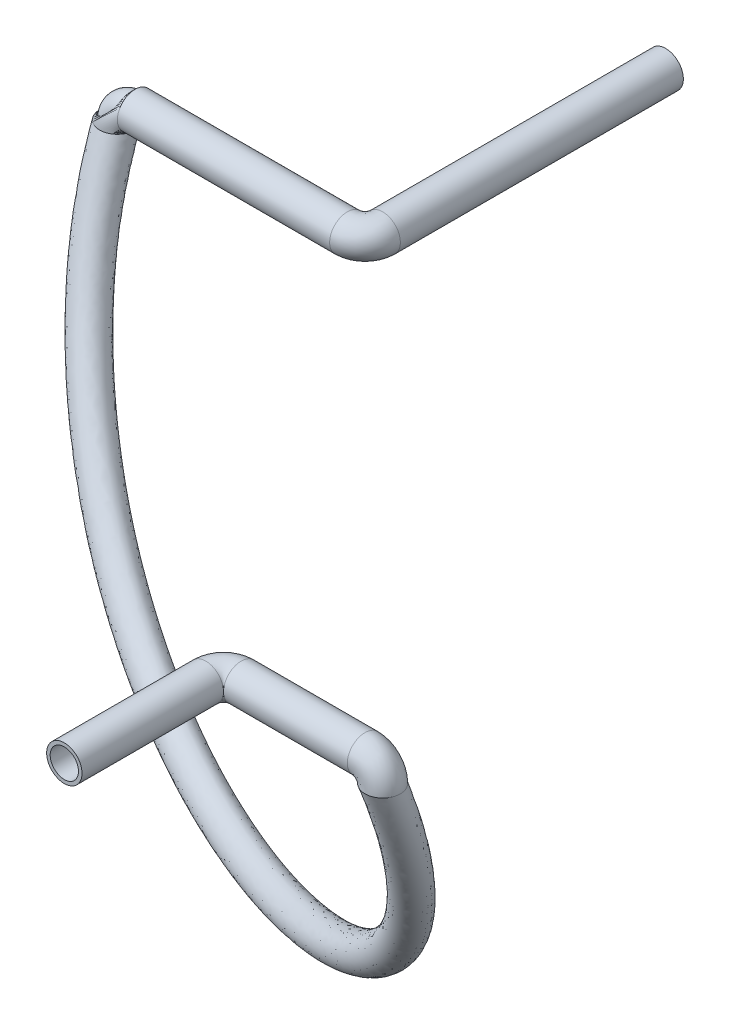
ISO-10303-21;
HEADER;
FILE_DESCRIPTION(('STEP AP214'),'2;1');
FILE_NAME('part.step','',(''),(''),'','','');
FILE_SCHEMA(('AUTOMOTIVE_DESIGN { 1 0 10303 214 1 1 1 1 }'));
ENDSEC;
DATA;
#1=APPLICATION_CONTEXT('core data for automotive mechanical design processes');
#2=APPLICATION_PROTOCOL_DEFINITION('international standard','automotive_design',2000,#1);
#3=PRODUCT_CONTEXT('',#1,'mechanical');
#4=PRODUCT('Part','Part','',(#3));
#5=PRODUCT_RELATED_PRODUCT_CATEGORY('part','',(#4));
#6=PRODUCT_DEFINITION_FORMATION('','',#4);
#7=PRODUCT_DEFINITION_CONTEXT('part definition',#1,'design');
#8=PRODUCT_DEFINITION('design','',#6,#7);
#9=PRODUCT_DEFINITION_SHAPE('','',#8);
#10=(LENGTH_UNIT() NAMED_UNIT(*) SI_UNIT(.MILLI.,.METRE.));
#11=(NAMED_UNIT(*) PLANE_ANGLE_UNIT() SI_UNIT($,.RADIAN.));
#12=(NAMED_UNIT(*) SI_UNIT($,.STERADIAN.) SOLID_ANGLE_UNIT());
#13=UNCERTAINTY_MEASURE_WITH_UNIT(LENGTH_MEASURE(1.E-05),#10,'distance_accuracy_value','');
#14=(GEOMETRIC_REPRESENTATION_CONTEXT(3) GLOBAL_UNCERTAINTY_ASSIGNED_CONTEXT((#13)) GLOBAL_UNIT_ASSIGNED_CONTEXT((#10,
#11,#12)) REPRESENTATION_CONTEXT('',''));
#15=CARTESIAN_POINT('',(0.,0.,0.));
#16=DIRECTION('',(0.,0.,1.));
#17=DIRECTION('',(1.,0.,0.));
#18=AXIS2_PLACEMENT_3D('',#15,#16,#17);
#19=CARTESIAN_POINT('',(10.,0.,0.500000000000001));
#20=CARTESIAN_POINT('',(10.,-1.43778293994973,-0.0681818181818162));
#21=CARTESIAN_POINT('',(9.59492973614497,-2.81732556841429,-0.636363636363633));
#22=CARTESIAN_POINT('',(9.18985947228995,-4.19686819687886,-1.20454545454545));
#23=CARTESIAN_POINT('',(8.41253532831181,-5.40640817455597,-1.77272727272727));
#24=CARTESIAN_POINT('',(7.63521118433368,-6.61594815223309,-2.34090909090908));
#25=CARTESIAN_POINT('',(6.54860733945285,-7.55749574354258,-2.9090909090909));
#26=CARTESIAN_POINT('',(5.46200349457203,-8.49904333485207,-3.47727272727272));
#27=CARTESIAN_POINT('',(4.15415013001887,-9.09631995354518,-4.04545454545454));
#28=CARTESIAN_POINT('',(2.84629676546571,-9.69359657223829,-4.61363636363635));
#29=CARTESIAN_POINT('',(1.42314838273286,-9.89821441880933,-5.18181818181817));
#30=CARTESIAN_POINT('',(0.,-10.1028322653804,-5.74999999999999));
#31=CARTESIAN_POINT('',(-1.42314838273285,-9.89821441880933,-6.3181818181818));
#32=CARTESIAN_POINT('',(-2.8462967654657,-9.6935965722383,-6.88636363636362));
#33=CARTESIAN_POINT('',(-4.15415013001886,-9.09631995354519,-7.45454545454544));
#34=CARTESIAN_POINT('',(-5.46200349457202,-8.49904333485208,-8.02272727272725));
#35=CARTESIAN_POINT('',(-6.54860733945285,-7.55749574354259,-8.59090909090907));
#36=CARTESIAN_POINT('',(-7.63521118433367,-6.6159481522331,-9.15909090909089));
#37=CARTESIAN_POINT('',(-8.41253532831181,-5.40640817455598,-9.7272727272727));
#38=CARTESIAN_POINT('',(-9.18985947228995,-4.19686819687886,-10.2954545454545));
#39=CARTESIAN_POINT('',(-9.59492973614497,-2.8173255684143,-10.8636363636363));
#40=CARTESIAN_POINT('',(-10.,-1.43778293994974,-11.4318181818182));
#41=CARTESIAN_POINT('',(-10.,0.,-12.));
#42=CARTESIAN_POINT('',(-10.,1.43778293994973,-12.5681818181818));
#43=CARTESIAN_POINT('',(-9.59492973614498,2.81732556841429,-13.1363636363636));
#44=CARTESIAN_POINT('',(11.,0.,0.500000000000001));
#45=CARTESIAN_POINT('',(11.,-1.5815612339447,-0.0681818181818162));
#46=CARTESIAN_POINT('',(10.5544227097595,-3.09905812525572,-0.636363636363633));
#47=CARTESIAN_POINT('',(10.1088454195189,-4.61655501656674,-1.20454545454545));
#48=CARTESIAN_POINT('',(9.253788861143,-5.94704899201157,-1.77272727272727));
#49=CARTESIAN_POINT('',(8.39873230276705,-7.2775429674564,-2.34090909090908));
#50=CARTESIAN_POINT('',(7.20346807339814,-8.31324531789684,-2.9090909090909));
#51=CARTESIAN_POINT('',(6.00820384402923,-9.34894766833728,-3.47727272727272));
#52=CARTESIAN_POINT('',(4.56956514302076,-10.0059519488997,-4.04545454545454));
#53=CARTESIAN_POINT('',(3.13092644201228,-10.6629562294621,-4.61363636363635));
#54=CARTESIAN_POINT('',(1.56546322100614,-10.8880358606903,-5.18181818181817));
#55=CARTESIAN_POINT('',(0.,-11.1131154919184,-5.74999999999999));
#56=CARTESIAN_POINT('',(-1.56546322100613,-10.8880358606903,-6.3181818181818));
#57=CARTESIAN_POINT('',(-3.13092644201227,-10.6629562294621,-6.88636363636362));
#58=CARTESIAN_POINT('',(-4.56956514302075,-10.0059519488997,-7.45454545454544));
#59=CARTESIAN_POINT('',(-6.00820384402922,-9.34894766833729,-8.02272727272725));
#60=CARTESIAN_POINT('',(-7.20346807339813,-8.31324531789685,-8.59090909090907));
#61=CARTESIAN_POINT('',(-8.39873230276704,-7.27754296745641,-9.15909090909089));
#62=CARTESIAN_POINT('',(-9.25378886114299,-5.94704899201158,-9.7272727272727));
#63=CARTESIAN_POINT('',(-10.1088454195189,-4.61655501656675,-10.2954545454545));
#64=CARTESIAN_POINT('',(-10.5544227097595,-3.09905812525573,-10.8636363636363));
#65=CARTESIAN_POINT('',(-11.,-1.58156123394471,-11.4318181818182));
#66=CARTESIAN_POINT('',(-11.,0.,-12.));
#67=CARTESIAN_POINT('',(-11.,1.5815612339447,-12.5681818181818));
#68=CARTESIAN_POINT('',(-10.5544227097595,3.09905812525572,-13.1363636363636));
#69=CARTESIAN_POINT('',(11.,0.,-0.500000000000001));
#70=CARTESIAN_POINT('',(11.,-1.5815612339447,-1.06818181818182));
#71=CARTESIAN_POINT('',(10.5544227097595,-3.09905812525572,-1.63636363636363));
#72=CARTESIAN_POINT('',(10.1088454195189,-4.61655501656674,-2.20454545454545));
#73=CARTESIAN_POINT('',(9.253788861143,-5.94704899201157,-2.77272727272727));
#74=CARTESIAN_POINT('',(8.39873230276705,-7.2775429674564,-3.34090909090909));
#75=CARTESIAN_POINT('',(7.20346807339814,-8.31324531789684,-3.9090909090909));
#76=CARTESIAN_POINT('',(6.00820384402923,-9.34894766833728,-4.47727272727272));
#77=CARTESIAN_POINT('',(4.56956514302076,-10.0059519488997,-5.04545454545454));
#78=CARTESIAN_POINT('',(3.13092644201228,-10.6629562294621,-5.61363636363635));
#79=CARTESIAN_POINT('',(1.56546322100614,-10.8880358606903,-6.18181818181817));
#80=CARTESIAN_POINT('',(0.,-11.1131154919184,-6.74999999999999));
#81=CARTESIAN_POINT('',(-1.56546322100613,-10.8880358606903,-7.3181818181818));
#82=CARTESIAN_POINT('',(-3.13092644201227,-10.6629562294621,-7.88636363636362));
#83=CARTESIAN_POINT('',(-4.56956514302075,-10.0059519488997,-8.45454545454544));
#84=CARTESIAN_POINT('',(-6.00820384402922,-9.34894766833729,-9.02272727272725));
#85=CARTESIAN_POINT('',(-7.20346807339813,-8.31324531789685,-9.59090909090907));
#86=CARTESIAN_POINT('',(-8.39873230276704,-7.27754296745641,-10.1590909090909));
#87=CARTESIAN_POINT('',(-9.25378886114299,-5.94704899201158,-10.7272727272727));
#88=CARTESIAN_POINT('',(-10.1088454195189,-4.61655501656675,-11.2954545454545));
#89=CARTESIAN_POINT('',(-10.5544227097595,-3.09905812525573,-11.8636363636363));
#90=CARTESIAN_POINT('',(-11.,-1.58156123394471,-12.4318181818182));
#91=CARTESIAN_POINT('',(-11.,0.,-13.));
#92=CARTESIAN_POINT('',(-11.,1.5815612339447,-13.5681818181818));
#93=CARTESIAN_POINT('',(-10.5544227097595,3.09905812525572,-14.1363636363636));
#94=CARTESIAN_POINT('',(10.,0.,-0.500000000000001));
#95=CARTESIAN_POINT('',(10.,-1.43778293994973,-1.06818181818182));
#96=CARTESIAN_POINT('',(9.59492973614497,-2.81732556841429,-1.63636363636363));
#97=CARTESIAN_POINT('',(9.18985947228995,-4.19686819687886,-2.20454545454545));
#98=CARTESIAN_POINT('',(8.41253532831181,-5.40640817455597,-2.77272727272727));
#99=CARTESIAN_POINT('',(7.63521118433368,-6.61594815223309,-3.34090909090909));
#100=CARTESIAN_POINT('',(6.54860733945285,-7.55749574354258,-3.9090909090909));
#101=CARTESIAN_POINT('',(5.46200349457203,-8.49904333485207,-4.47727272727272));
#102=CARTESIAN_POINT('',(4.15415013001887,-9.09631995354518,-5.04545454545454));
#103=CARTESIAN_POINT('',(2.84629676546571,-9.69359657223829,-5.61363636363635));
#104=CARTESIAN_POINT('',(1.42314838273286,-9.89821441880933,-6.18181818181817));
#105=CARTESIAN_POINT('',(0.,-10.1028322653804,-6.74999999999999));
#106=CARTESIAN_POINT('',(-1.42314838273285,-9.89821441880933,-7.3181818181818));
#107=CARTESIAN_POINT('',(-2.8462967654657,-9.6935965722383,-7.88636363636362));
#108=CARTESIAN_POINT('',(-4.15415013001886,-9.09631995354519,-8.45454545454544));
#109=CARTESIAN_POINT('',(-5.46200349457202,-8.49904333485208,-9.02272727272726));
#110=CARTESIAN_POINT('',(-6.54860733945285,-7.55749574354259,-9.59090909090907));
#111=CARTESIAN_POINT('',(-7.63521118433367,-6.6159481522331,-10.1590909090909));
#112=CARTESIAN_POINT('',(-8.41253532831181,-5.40640817455598,-10.7272727272727));
#113=CARTESIAN_POINT('',(-9.18985947228995,-4.19686819687886,-11.2954545454545));
#114=CARTESIAN_POINT('',(-9.59492973614497,-2.8173255684143,-11.8636363636363));
#115=CARTESIAN_POINT('',(-10.,-1.43778293994974,-12.4318181818182));
#116=CARTESIAN_POINT('',(-10.,0.,-13.));
#117=CARTESIAN_POINT('',(-10.,1.43778293994973,-13.5681818181818));
#118=CARTESIAN_POINT('',(-9.59492973614498,2.81732556841429,-14.1363636363636));
#119=CARTESIAN_POINT('',(9.,0.,-0.500000000000001));
#120=CARTESIAN_POINT('',(9.,-1.29400464595476,-1.06818181818182));
#121=CARTESIAN_POINT('',(8.63543676253048,-2.53559301157286,-1.63636363636363));
#122=CARTESIAN_POINT('',(8.27087352506095,-3.77718137719097,-2.20454545454545));
#123=CARTESIAN_POINT('',(7.57128179548063,-4.86576735710037,-2.77272727272727));
#124=CARTESIAN_POINT('',(6.87169006590031,-5.95435333700978,-3.34090909090909));
#125=CARTESIAN_POINT('',(5.89374660550757,-6.80174616918832,-3.9090909090909));
#126=CARTESIAN_POINT('',(4.91580314511483,-7.64913900136686,-4.47727272727272));
#127=CARTESIAN_POINT('',(3.73873511701698,-8.18668795819066,-5.04545454545454));
#128=CARTESIAN_POINT('',(2.56166708891914,-8.72423691501446,-5.61363636363635));
#129=CARTESIAN_POINT('',(1.28083354445957,-8.90839297692839,-6.18181818181817));
#130=CARTESIAN_POINT('',(0.,-9.09254903884232,-6.74999999999999));
#131=CARTESIAN_POINT('',(-1.28083354445956,-8.9083929769284,-7.3181818181818));
#132=CARTESIAN_POINT('',(-2.56166708891913,-8.72423691501447,-7.88636363636362));
#133=CARTESIAN_POINT('',(-3.73873511701697,-8.18668795819067,-8.45454545454544));
#134=CARTESIAN_POINT('',(-4.91580314511482,-7.64913900136687,-9.02272727272725));
#135=CARTESIAN_POINT('',(-5.89374660550756,-6.80174616918833,-9.59090909090907));
#136=CARTESIAN_POINT('',(-6.8716900659003,-5.95435333700979,-10.1590909090909));
#137=CARTESIAN_POINT('',(-7.57128179548063,-4.86576735710038,-10.7272727272727));
#138=CARTESIAN_POINT('',(-8.27087352506095,-3.77718137719098,-11.2954545454545));
#139=CARTESIAN_POINT('',(-8.63543676253047,-2.53559301157287,-11.8636363636363));
#140=CARTESIAN_POINT('',(-9.,-1.29400464595476,-12.4318181818182));
#141=CARTESIAN_POINT('',(-9.,0.,-13.));
#142=CARTESIAN_POINT('',(-9.,1.29400464595475,-13.5681818181818));
#143=CARTESIAN_POINT('',(-8.63543676253048,2.53559301157286,-14.1363636363636));
#144=CARTESIAN_POINT('',(9.,0.,0.500000000000001));
#145=CARTESIAN_POINT('',(9.,-1.29400464595476,-0.0681818181818162));
#146=CARTESIAN_POINT('',(8.63543676253048,-2.53559301157286,-0.636363636363633));
#147=CARTESIAN_POINT('',(8.27087352506095,-3.77718137719097,-1.20454545454545));
#148=CARTESIAN_POINT('',(7.57128179548063,-4.86576735710037,-1.77272727272727));
#149=CARTESIAN_POINT('',(6.87169006590031,-5.95435333700978,-2.34090909090908));
#150=CARTESIAN_POINT('',(5.89374660550757,-6.80174616918832,-2.9090909090909));
#151=CARTESIAN_POINT('',(4.91580314511483,-7.64913900136686,-3.47727272727272));
#152=CARTESIAN_POINT('',(3.73873511701698,-8.18668795819066,-4.04545454545454));
#153=CARTESIAN_POINT('',(2.56166708891914,-8.72423691501446,-4.61363636363635));
#154=CARTESIAN_POINT('',(1.28083354445957,-8.90839297692839,-5.18181818181817));
#155=CARTESIAN_POINT('',(0.,-9.09254903884232,-5.74999999999999));
#156=CARTESIAN_POINT('',(-1.28083354445956,-8.9083929769284,-6.3181818181818));
#157=CARTESIAN_POINT('',(-2.56166708891913,-8.72423691501447,-6.88636363636362));
#158=CARTESIAN_POINT('',(-3.73873511701697,-8.18668795819067,-7.45454545454544));
#159=CARTESIAN_POINT('',(-4.91580314511482,-7.64913900136687,-8.02272727272725));
#160=CARTESIAN_POINT('',(-5.89374660550756,-6.80174616918833,-8.59090909090907));
#161=CARTESIAN_POINT('',(-6.8716900659003,-5.95435333700979,-9.15909090909089));
#162=CARTESIAN_POINT('',(-7.57128179548063,-4.86576735710038,-9.7272727272727));
#163=CARTESIAN_POINT('',(-8.27087352506095,-3.77718137719098,-10.2954545454545));
#164=CARTESIAN_POINT('',(-8.63543676253047,-2.53559301157287,-10.8636363636363));
#165=CARTESIAN_POINT('',(-9.,-1.29400464595476,-11.4318181818182));
#166=CARTESIAN_POINT('',(-9.,0.,-12.));
#167=CARTESIAN_POINT('',(-9.,1.29400464595475,-12.5681818181818));
#168=CARTESIAN_POINT('',(-8.63543676253048,2.53559301157286,-13.1363636363636));
#169=CARTESIAN_POINT('',(10.,0.,0.500000000000001));
#170=CARTESIAN_POINT('',(10.,-1.43778293994973,-0.0681818181818162));
#171=CARTESIAN_POINT('',(9.59492973614497,-2.81732556841429,-0.636363636363633));
#172=CARTESIAN_POINT('',(9.18985947228995,-4.19686819687886,-1.20454545454545));
#173=CARTESIAN_POINT('',(8.41253532831181,-5.40640817455597,-1.77272727272727));
#174=CARTESIAN_POINT('',(7.63521118433368,-6.61594815223309,-2.34090909090908));
#175=CARTESIAN_POINT('',(6.54860733945285,-7.55749574354258,-2.9090909090909));
#176=CARTESIAN_POINT('',(5.46200349457203,-8.49904333485207,-3.47727272727272));
#177=CARTESIAN_POINT('',(4.15415013001887,-9.09631995354518,-4.04545454545454));
#178=CARTESIAN_POINT('',(2.84629676546571,-9.69359657223829,-4.61363636363635));
#179=CARTESIAN_POINT('',(1.42314838273286,-9.89821441880933,-5.18181818181817));
#180=CARTESIAN_POINT('',(0.,-10.1028322653804,-5.74999999999999));
#181=CARTESIAN_POINT('',(-1.42314838273285,-9.89821441880933,-6.3181818181818));
#182=CARTESIAN_POINT('',(-2.8462967654657,-9.6935965722383,-6.88636363636362));
#183=CARTESIAN_POINT('',(-4.15415013001886,-9.09631995354519,-7.45454545454544));
#184=CARTESIAN_POINT('',(-5.46200349457202,-8.49904333485208,-8.02272727272725));
#185=CARTESIAN_POINT('',(-6.54860733945285,-7.55749574354259,-8.59090909090907));
#186=CARTESIAN_POINT('',(-7.63521118433367,-6.6159481522331,-9.15909090909089));
#187=CARTESIAN_POINT('',(-8.41253532831181,-5.40640817455598,-9.7272727272727));
#188=CARTESIAN_POINT('',(-9.18985947228995,-4.19686819687886,-10.2954545454545));
#189=CARTESIAN_POINT('',(-9.59492973614497,-2.8173255684143,-10.8636363636363));
#190=CARTESIAN_POINT('',(-10.,-1.43778293994974,-11.4318181818182));
#191=CARTESIAN_POINT('',(-10.,0.,-12.));
#192=CARTESIAN_POINT('',(-10.,1.43778293994973,-12.5681818181818));
#193=CARTESIAN_POINT('',(-9.59492973614498,2.81732556841429,-13.1363636363636));
#194=(BOUNDED_SURFACE() B_SPLINE_SURFACE(3,2,((#19,#20,#21,#22,#23,#24,#25,#26,#27,#28,#29,#30,
#31,#32,#33,#34,#35,#36,#37,#38,#39,#40,#41,#42,#43),(#44,#45,#46,#47,#48,#49,#50,#51,#52,#53,
#54,#55,#56,#57,#58,#59,#60,#61,#62,#63,#64,#65,#66,#67,#68),(#69,#70,#71,#72,#73,#74,#75,#76,
#77,#78,#79,#80,#81,#82,#83,#84,#85,#86,#87,#88,#89,#90,#91,#92,#93),(#94,#95,#96,#97,#98,#99,
#100,#101,#102,#103,#104,#105,#106,#107,#108,#109,#110,#111,#112,#113,#114,#115,#116,#117,#118),
(#119,#120,#121,#122,#123,#124,#125,#126,#127,#128,#129,#130,#131,#132,#133,#134,#135,#136,#137,
#138,#139,#140,#141,#142,#143),(#144,#145,#146,#147,#148,#149,#150,#151,#152,#153,#154,#155,
#156,#157,#158,#159,#160,#161,#162,#163,#164,#165,#166,#167,#168),(#169,#170,#171,#172,#173,
#174,#175,#176,#177,#178,#179,#180,#181,#182,#183,#184,#185,#186,#187,#188,#189,#190,#191,#192,
#193)),.UNSPECIFIED.,.T.,.F.,.F.) B_SPLINE_SURFACE_WITH_KNOTS((4,3,4),(3,2,2,2,2,2,2,2,2,2,2,2,
3),(0.,0.5,1.),(0.,0.0833333333333333,0.166666666666667,0.25,0.333333333333333,
0.416666666666667,0.5,0.583333333333333,0.666666666666667,0.75,0.833333333333333,
0.916666666666667,1.),
.UNSPECIFIED.) GEOMETRIC_REPRESENTATION_ITEM() RATIONAL_B_SPLINE_SURFACE(((1.,0.989821441880933,
1.,0.989821441880933,1.,0.989821441880933,1.,0.989821441880933,1.,0.989821441880933,1.,
0.989821441880933,1.,0.989821441880933,1.,0.989821441880933,1.,0.989821441880933,1.,
0.989821441880933,1.,0.989821441880933,1.,0.989821441880933,1.),(0.333333333333333,
0.329940480626978,0.333333333333333,0.329940480626978,0.333333333333333,0.329940480626978,
0.333333333333333,0.329940480626978,0.333333333333333,0.329940480626978,0.333333333333333,
0.329940480626978,0.333333333333333,0.329940480626978,0.333333333333333,0.329940480626978,
0.333333333333333,0.329940480626978,0.333333333333333,0.329940480626978,0.333333333333333,
0.329940480626978,0.333333333333333,0.329940480626978,0.333333333333333),(0.333333333333333,
0.329940480626978,0.333333333333333,0.329940480626978,0.333333333333333,0.329940480626978,
0.333333333333333,0.329940480626978,0.333333333333333,0.329940480626978,0.333333333333333,
0.329940480626978,0.333333333333333,0.329940480626978,0.333333333333333,0.329940480626978,
0.333333333333333,0.329940480626978,0.333333333333333,0.329940480626978,0.333333333333333,
0.329940480626978,0.333333333333333,0.329940480626978,0.333333333333333),(1.,0.989821441880933,
1.,0.989821441880933,1.,0.989821441880933,1.,0.989821441880933,1.,0.989821441880933,1.,
0.989821441880933,1.,0.989821441880933,1.,0.989821441880933,1.,0.989821441880933,1.,
0.989821441880933,1.,0.989821441880933,1.,0.989821441880933,1.),(0.333333333333333,
0.329940480626978,0.333333333333333,0.329940480626978,0.333333333333333,0.329940480626978,
0.333333333333333,0.329940480626978,0.333333333333333,0.329940480626978,0.333333333333333,
0.329940480626978,0.333333333333333,0.329940480626978,0.333333333333333,0.329940480626978,
0.333333333333333,0.329940480626978,0.333333333333333,0.329940480626978,0.333333333333333,
0.329940480626978,0.333333333333333,0.329940480626978,0.333333333333333),(0.333333333333333,
0.329940480626978,0.333333333333333,0.329940480626978,0.333333333333333,0.329940480626978,
0.333333333333333,0.329940480626978,0.333333333333333,0.329940480626978,0.333333333333333,
0.329940480626978,0.333333333333333,0.329940480626978,0.333333333333333,0.329940480626978,
0.333333333333333,0.329940480626978,0.333333333333333,0.329940480626978,0.333333333333333,
0.329940480626978,0.333333333333333,0.329940480626978,0.333333333333333),(1.,0.989821441880933,
1.,0.989821441880933,1.,0.989821441880933,1.,0.989821441880933,1.,0.989821441880933,1.,
0.989821441880933,1.,0.989821441880933,1.,0.989821441880933,1.,0.989821441880933,1.,
0.989821441880933,1.,0.989821441880933,1.,0.989821441880933,1.))) REPRESENTATION_ITEM('') SURFACE());
#195=CARTESIAN_POINT('',(-10.,0.,-12.5));
#196=DIRECTION('',(0.,-1.,0.));
#197=DIRECTION('',(0.,0.,1.));
#198=AXIS2_PLACEMENT_3D('',#195,#196,#197);
#199=CIRCLE('',#198,0.500000000000001);
#200=CARTESIAN_POINT('',(-9.5,0.,-12.5));
#201=VERTEX_POINT('',#200);
#202=EDGE_CURVE('E58',#201,#201,#199,.T.);
#203=CARTESIAN_POINT('',(10.,0.,0.));
#204=DIRECTION('',(0.,1.,0.));
#205=DIRECTION('',(0.,0.,1.));
#206=AXIS2_PLACEMENT_3D('',#203,#204,#205);
#207=CIRCLE('',#206,0.500000000000001);
#208=CARTESIAN_POINT('',(9.5,0.,0.));
#209=VERTEX_POINT('',#208);
#210=EDGE_CURVE('E120',#209,#209,#207,.T.);
#211=ORIENTED_EDGE('',*,*,#202,.T.);
#212=EDGE_LOOP('',(#211));
#213=FACE_BOUND('',#212,.T.);
#214=ORIENTED_EDGE('',*,*,#210,.F.);
#215=EDGE_LOOP('',(#214));
#216=FACE_BOUND('',#215,.T.);
#217=ADVANCED_FACE('F35',(#213,#216),#194,.F.);
#218=CARTESIAN_POINT('',(10.,0.,0.4));
#219=CARTESIAN_POINT('',(10.,-1.43778293994973,-0.168181818181817));
#220=CARTESIAN_POINT('',(9.59492973614497,-2.81732556841429,-0.736363636363634));
#221=CARTESIAN_POINT('',(9.18985947228995,-4.19686819687886,-1.30454545454545));
#222=CARTESIAN_POINT('',(8.41253532831181,-5.40640817455597,-1.87272727272727));
#223=CARTESIAN_POINT('',(7.63521118433368,-6.61594815223309,-2.44090909090909));
#224=CARTESIAN_POINT('',(6.54860733945285,-7.55749574354258,-3.0090909090909));
#225=CARTESIAN_POINT('',(5.46200349457203,-8.49904333485207,-3.57727272727272));
#226=CARTESIAN_POINT('',(4.15415013001887,-9.09631995354518,-4.14545454545454));
#227=CARTESIAN_POINT('',(2.84629676546571,-9.69359657223829,-4.71363636363635));
#228=CARTESIAN_POINT('',(1.42314838273286,-9.89821441880933,-5.28181818181817));
#229=CARTESIAN_POINT('',(0.,-10.1028322653804,-5.84999999999999));
#230=CARTESIAN_POINT('',(-1.42314838273285,-9.89821441880933,-6.4181818181818));
#231=CARTESIAN_POINT('',(-2.8462967654657,-9.6935965722383,-6.98636363636362));
#232=CARTESIAN_POINT('',(-4.15415013001886,-9.09631995354519,-7.55454545454544));
#233=CARTESIAN_POINT('',(-5.46200349457202,-8.49904333485208,-8.12272727272726));
#234=CARTESIAN_POINT('',(-6.54860733945285,-7.55749574354259,-8.69090909090907));
#235=CARTESIAN_POINT('',(-7.63521118433367,-6.6159481522331,-9.25909090909089));
#236=CARTESIAN_POINT('',(-8.41253532831181,-5.40640817455598,-9.8272727272727));
#237=CARTESIAN_POINT('',(-9.18985947228995,-4.19686819687886,-10.3954545454545));
#238=CARTESIAN_POINT('',(-9.59492973614497,-2.8173255684143,-10.9636363636363));
#239=CARTESIAN_POINT('',(-10.,-1.43778293994974,-11.5318181818182));
#240=CARTESIAN_POINT('',(-10.,0.,-12.1));
#241=CARTESIAN_POINT('',(-10.,1.43778293994973,-12.6681818181818));
#242=CARTESIAN_POINT('',(-9.59492973614498,2.81732556841429,-13.2363636363636));
#243=CARTESIAN_POINT('',(9.2,0.,0.4));
#244=CARTESIAN_POINT('',(9.2,-1.32276030475375,-0.168181818181817));
#245=CARTESIAN_POINT('',(8.82733535725338,-2.59193952294115,-0.736363636363635));
#246=CARTESIAN_POINT('',(8.45467071450675,-3.86111874112855,-1.30454545454545));
#247=CARTESIAN_POINT('',(7.73953250204687,-4.97389552059149,-1.87272727272727));
#248=CARTESIAN_POINT('',(7.02439428958698,-6.08667230005444,-2.44090909090908));
#249=CARTESIAN_POINT('',(6.02471875229663,-6.95289608405917,-3.0090909090909));
#250=CARTESIAN_POINT('',(5.02504321500627,-7.81911986806391,-3.57727272727272));
#251=CARTESIAN_POINT('',(3.82181811961736,-8.36861435726157,-4.14545454545454));
#252=CARTESIAN_POINT('',(2.61859302422845,-8.91810884645923,-4.71363636363635));
#253=CARTESIAN_POINT('',(1.30929651211423,-9.10635726530458,-5.28181818181817));
#254=CARTESIAN_POINT('',(0.,-9.29460568414993,-5.84999999999999));
#255=CARTESIAN_POINT('',(-1.30929651211422,-9.10635726530458,-6.4181818181818));
#256=CARTESIAN_POINT('',(-2.61859302422844,-8.91810884645923,-6.98636363636362));
#257=CARTESIAN_POINT('',(-3.82181811961735,-8.36861435726157,-7.55454545454544));
#258=CARTESIAN_POINT('',(-5.02504321500626,-7.81911986806391,-8.12272727272725));
#259=CARTESIAN_POINT('',(-6.02471875229662,-6.95289608405918,-8.69090909090907));
#260=CARTESIAN_POINT('',(-7.02439428958698,-6.08667230005445,-9.25909090909089));
#261=CARTESIAN_POINT('',(-7.73953250204686,-4.9738955205915,-9.8272727272727));
#262=CARTESIAN_POINT('',(-8.45467071450675,-3.86111874112856,-10.3954545454545));
#263=CARTESIAN_POINT('',(-8.82733535725338,-2.59193952294116,-10.9636363636363));
#264=CARTESIAN_POINT('',(-9.2,-1.32276030475376,-11.5318181818182));
#265=CARTESIAN_POINT('',(-9.2,0.,-12.1));
#266=CARTESIAN_POINT('',(-9.2,1.32276030475375,-12.6681818181818));
#267=CARTESIAN_POINT('',(-8.82733535725338,2.59193952294115,-13.2363636363636));
#268=CARTESIAN_POINT('',(9.2,0.,-0.4));
#269=CARTESIAN_POINT('',(9.2,-1.32276030475375,-0.968181818181817));
#270=CARTESIAN_POINT('',(8.82733535725338,-2.59193952294115,-1.53636363636363));
#271=CARTESIAN_POINT('',(8.45467071450675,-3.86111874112855,-2.10454545454545));
#272=CARTESIAN_POINT('',(7.73953250204687,-4.97389552059149,-2.67272727272727));
#273=CARTESIAN_POINT('',(7.02439428958698,-6.08667230005444,-3.24090909090908));
#274=CARTESIAN_POINT('',(6.02471875229663,-6.95289608405917,-3.8090909090909));
#275=CARTESIAN_POINT('',(5.02504321500627,-7.81911986806391,-4.37727272727272));
#276=CARTESIAN_POINT('',(3.82181811961736,-8.36861435726157,-4.94545454545453));
#277=CARTESIAN_POINT('',(2.61859302422845,-8.91810884645923,-5.51363636363635));
#278=CARTESIAN_POINT('',(1.30929651211423,-9.10635726530458,-6.08181818181817));
#279=CARTESIAN_POINT('',(0.,-9.29460568414993,-6.64999999999999));
#280=CARTESIAN_POINT('',(-1.30929651211422,-9.10635726530458,-7.2181818181818));
#281=CARTESIAN_POINT('',(-2.61859302422844,-8.91810884645923,-7.78636363636362));
#282=CARTESIAN_POINT('',(-3.82181811961735,-8.36861435726157,-8.35454545454544));
#283=CARTESIAN_POINT('',(-5.02504321500626,-7.81911986806391,-8.92272727272725));
#284=CARTESIAN_POINT('',(-6.02471875229662,-6.95289608405918,-9.49090909090907));
#285=CARTESIAN_POINT('',(-7.02439428958698,-6.08667230005445,-10.0590909090909));
#286=CARTESIAN_POINT('',(-7.73953250204686,-4.9738955205915,-10.6272727272727));
#287=CARTESIAN_POINT('',(-8.45467071450675,-3.86111874112856,-11.1954545454545));
#288=CARTESIAN_POINT('',(-8.82733535725338,-2.59193952294116,-11.7636363636363));
#289=CARTESIAN_POINT('',(-9.2,-1.32276030475376,-12.3318181818182));
#290=CARTESIAN_POINT('',(-9.2,0.,-12.9));
#291=CARTESIAN_POINT('',(-9.2,1.32276030475375,-13.4681818181818));
#292=CARTESIAN_POINT('',(-8.82733535725338,2.59193952294115,-14.0363636363636));
#293=CARTESIAN_POINT('',(10.,0.,-0.4));
#294=CARTESIAN_POINT('',(10.,-1.43778293994973,-0.968181818181816));
#295=CARTESIAN_POINT('',(9.59492973614497,-2.81732556841429,-1.53636363636363));
#296=CARTESIAN_POINT('',(9.18985947228995,-4.19686819687886,-2.10454545454545));
#297=CARTESIAN_POINT('',(8.41253532831181,-5.40640817455597,-2.67272727272727));
#298=CARTESIAN_POINT('',(7.63521118433368,-6.61594815223309,-3.24090909090908));
#299=CARTESIAN_POINT('',(6.54860733945285,-7.55749574354258,-3.8090909090909));
#300=CARTESIAN_POINT('',(5.46200349457203,-8.49904333485207,-4.37727272727272));
#301=CARTESIAN_POINT('',(4.15415013001887,-9.09631995354518,-4.94545454545453));
#302=CARTESIAN_POINT('',(2.84629676546571,-9.69359657223829,-5.51363636363635));
#303=CARTESIAN_POINT('',(1.42314838273286,-9.89821441880933,-6.08181818181817));
#304=CARTESIAN_POINT('',(0.,-10.1028322653804,-6.64999999999999));
#305=CARTESIAN_POINT('',(-1.42314838273285,-9.89821441880933,-7.2181818181818));
#306=CARTESIAN_POINT('',(-2.8462967654657,-9.6935965722383,-7.78636363636362));
#307=CARTESIAN_POINT('',(-4.15415013001886,-9.09631995354519,-8.35454545454544));
#308=CARTESIAN_POINT('',(-5.46200349457202,-8.49904333485208,-8.92272727272725));
#309=CARTESIAN_POINT('',(-6.54860733945285,-7.55749574354259,-9.49090909090907));
#310=CARTESIAN_POINT('',(-7.63521118433367,-6.6159481522331,-10.0590909090909));
#311=CARTESIAN_POINT('',(-8.41253532831181,-5.40640817455598,-10.6272727272727));
#312=CARTESIAN_POINT('',(-9.18985947228995,-4.19686819687886,-11.1954545454545));
#313=CARTESIAN_POINT('',(-9.59492973614497,-2.8173255684143,-11.7636363636363));
#314=CARTESIAN_POINT('',(-10.,-1.43778293994974,-12.3318181818182));
#315=CARTESIAN_POINT('',(-10.,0.,-12.9));
#316=CARTESIAN_POINT('',(-10.,1.43778293994973,-13.4681818181818));
#317=CARTESIAN_POINT('',(-9.59492973614498,2.81732556841429,-14.0363636363636));
#318=CARTESIAN_POINT('',(10.8,0.,-0.399999999999999));
#319=CARTESIAN_POINT('',(10.8,-1.55280557514571,-0.968181818181816));
#320=CARTESIAN_POINT('',(10.3625241150366,-3.04271161388744,-1.53636363636363));
#321=CARTESIAN_POINT('',(9.92504823007314,-4.53261765262916,-2.10454545454545));
#322=CARTESIAN_POINT('',(9.08553815457676,-5.83892082852045,-2.67272727272727));
#323=CARTESIAN_POINT('',(8.24602807908037,-7.14522400441174,-3.24090909090908));
#324=CARTESIAN_POINT('',(7.07249592660908,-8.16209540302598,-3.8090909090909));
#325=CARTESIAN_POINT('',(5.89896377413779,-9.17896680164024,-4.37727272727272));
#326=CARTESIAN_POINT('',(4.48648214042038,-9.82402554982879,-4.94545454545453));
#327=CARTESIAN_POINT('',(3.07400050670296,-10.4690842980174,-5.51363636363635));
#328=CARTESIAN_POINT('',(1.53700025335148,-10.6900715723141,-6.08181818181817));
#329=CARTESIAN_POINT('',(0.,-10.9110588466108,-6.64999999999999));
#330=CARTESIAN_POINT('',(-1.53700025335147,-10.6900715723141,-7.2181818181818));
#331=CARTESIAN_POINT('',(-3.07400050670295,-10.4690842980174,-7.78636363636362));
#332=CARTESIAN_POINT('',(-4.48648214042037,-9.8240255498288,-8.35454545454544));
#333=CARTESIAN_POINT('',(-5.89896377413778,-9.17896680164024,-8.92272727272725));
#334=CARTESIAN_POINT('',(-7.07249592660907,-8.16209540302599,-9.49090909090907));
#335=CARTESIAN_POINT('',(-8.24602807908036,-7.14522400441174,-10.0590909090909));
#336=CARTESIAN_POINT('',(-9.08553815457675,-5.83892082852046,-10.6272727272727));
#337=CARTESIAN_POINT('',(-9.92504823007314,-4.53261765262917,-11.1954545454545));
#338=CARTESIAN_POINT('',(-10.3625241150366,-3.04271161388744,-11.7636363636363));
#339=CARTESIAN_POINT('',(-10.8,-1.55280557514572,-12.3318181818182));
#340=CARTESIAN_POINT('',(-10.8,0.,-12.9));
#341=CARTESIAN_POINT('',(-10.8,1.5528055751457,-13.4681818181818));
#342=CARTESIAN_POINT('',(-10.3625241150366,3.04271161388743,-14.0363636363636));
#343=CARTESIAN_POINT('',(10.8,0.,0.4));
#344=CARTESIAN_POINT('',(10.8,-1.55280557514571,-0.168181818181817));
#345=CARTESIAN_POINT('',(10.3625241150366,-3.04271161388744,-0.736363636363635));
#346=CARTESIAN_POINT('',(9.92504823007314,-4.53261765262916,-1.30454545454545));
#347=CARTESIAN_POINT('',(9.08553815457676,-5.83892082852045,-1.87272727272727));
#348=CARTESIAN_POINT('',(8.24602807908037,-7.14522400441174,-2.44090909090908));
#349=CARTESIAN_POINT('',(7.07249592660908,-8.16209540302598,-3.0090909090909));
#350=CARTESIAN_POINT('',(5.89896377413779,-9.17896680164024,-3.57727272727272));
#351=CARTESIAN_POINT('',(4.48648214042038,-9.82402554982879,-4.14545454545454));
#352=CARTESIAN_POINT('',(3.07400050670296,-10.4690842980174,-4.71363636363635));
#353=CARTESIAN_POINT('',(1.53700025335148,-10.6900715723141,-5.28181818181817));
#354=CARTESIAN_POINT('',(0.,-10.9110588466108,-5.84999999999999));
#355=CARTESIAN_POINT('',(-1.53700025335147,-10.6900715723141,-6.4181818181818));
#356=CARTESIAN_POINT('',(-3.07400050670295,-10.4690842980174,-6.98636363636362));
#357=CARTESIAN_POINT('',(-4.48648214042037,-9.8240255498288,-7.55454545454544));
#358=CARTESIAN_POINT('',(-5.89896377413778,-9.17896680164024,-8.12272727272725));
#359=CARTESIAN_POINT('',(-7.07249592660907,-8.16209540302599,-8.69090909090907));
#360=CARTESIAN_POINT('',(-8.24602807908036,-7.14522400441174,-9.25909090909089));
#361=CARTESIAN_POINT('',(-9.08553815457675,-5.83892082852046,-9.8272727272727));
#362=CARTESIAN_POINT('',(-9.92504823007314,-4.53261765262917,-10.3954545454545));
#363=CARTESIAN_POINT('',(-10.3625241150366,-3.04271161388744,-10.9636363636363));
#364=CARTESIAN_POINT('',(-10.8,-1.55280557514572,-11.5318181818182));
#365=CARTESIAN_POINT('',(-10.8,0.,-12.1));
#366=CARTESIAN_POINT('',(-10.8,1.5528055751457,-12.6681818181818));
#367=CARTESIAN_POINT('',(-10.3625241150366,3.04271161388743,-13.2363636363636));
#368=CARTESIAN_POINT('',(10.,0.,0.4));
#369=CARTESIAN_POINT('',(10.,-1.43778293994973,-0.168181818181817));
#370=CARTESIAN_POINT('',(9.59492973614497,-2.81732556841429,-0.736363636363634));
#371=CARTESIAN_POINT('',(9.18985947228995,-4.19686819687886,-1.30454545454545));
#372=CARTESIAN_POINT('',(8.41253532831181,-5.40640817455597,-1.87272727272727));
#373=CARTESIAN_POINT('',(7.63521118433368,-6.61594815223309,-2.44090909090909));
#374=CARTESIAN_POINT('',(6.54860733945285,-7.55749574354258,-3.0090909090909));
#375=CARTESIAN_POINT('',(5.46200349457203,-8.49904333485207,-3.57727272727272));
#376=CARTESIAN_POINT('',(4.15415013001887,-9.09631995354518,-4.14545454545454));
#377=CARTESIAN_POINT('',(2.84629676546571,-9.69359657223829,-4.71363636363635));
#378=CARTESIAN_POINT('',(1.42314838273286,-9.89821441880933,-5.28181818181817));
#379=CARTESIAN_POINT('',(0.,-10.1028322653804,-5.84999999999999));
#380=CARTESIAN_POINT('',(-1.42314838273285,-9.89821441880933,-6.4181818181818));
#381=CARTESIAN_POINT('',(-2.8462967654657,-9.6935965722383,-6.98636363636362));
#382=CARTESIAN_POINT('',(-4.15415013001886,-9.09631995354519,-7.55454545454544));
#383=CARTESIAN_POINT('',(-5.46200349457202,-8.49904333485208,-8.12272727272726));
#384=CARTESIAN_POINT('',(-6.54860733945285,-7.55749574354259,-8.69090909090907));
#385=CARTESIAN_POINT('',(-7.63521118433367,-6.6159481522331,-9.25909090909089));
#386=CARTESIAN_POINT('',(-8.41253532831181,-5.40640817455598,-9.8272727272727));
#387=CARTESIAN_POINT('',(-9.18985947228995,-4.19686819687886,-10.3954545454545));
#388=CARTESIAN_POINT('',(-9.59492973614497,-2.8173255684143,-10.9636363636363));
#389=CARTESIAN_POINT('',(-10.,-1.43778293994974,-11.5318181818182));
#390=CARTESIAN_POINT('',(-10.,0.,-12.1));
#391=CARTESIAN_POINT('',(-10.,1.43778293994973,-12.6681818181818));
#392=CARTESIAN_POINT('',(-9.59492973614498,2.81732556841429,-13.2363636363636));
#393=(BOUNDED_SURFACE() B_SPLINE_SURFACE(3,2,((#218,#219,#220,#221,#222,#223,#224,#225,#226,
#227,#228,#229,#230,#231,#232,#233,#234,#235,#236,#237,#238,#239,#240,#241,#242),(#243,#244,
#245,#246,#247,#248,#249,#250,#251,#252,#253,#254,#255,#256,#257,#258,#259,#260,#261,#262,#263,
#264,#265,#266,#267),(#268,#269,#270,#271,#272,#273,#274,#275,#276,#277,#278,#279,#280,#281,
#282,#283,#284,#285,#286,#287,#288,#289,#290,#291,#292),(#293,#294,#295,#296,#297,#298,#299,
#300,#301,#302,#303,#304,#305,#306,#307,#308,#309,#310,#311,#312,#313,#314,#315,#316,#317),
(#318,#319,#320,#321,#322,#323,#324,#325,#326,#327,#328,#329,#330,#331,#332,#333,#334,#335,#336,
#337,#338,#339,#340,#341,#342),(#343,#344,#345,#346,#347,#348,#349,#350,#351,#352,#353,#354,
#355,#356,#357,#358,#359,#360,#361,#362,#363,#364,#365,#366,#367),(#368,#369,#370,#371,#372,
#373,#374,#375,#376,#377,#378,#379,#380,#381,#382,#383,#384,#385,#386,#387,#388,#389,#390,#391,
#392)),.UNSPECIFIED.,.T.,.F.,.F.) B_SPLINE_SURFACE_WITH_KNOTS((4,3,4),(3,2,2,2,2,2,2,2,2,2,2,2,
3),(0.,0.5,1.),(0.,0.0833333333333333,0.166666666666667,0.25,0.333333333333333,
0.416666666666667,0.5,0.583333333333333,0.666666666666667,0.75,0.833333333333333,
0.916666666666667,1.),
.UNSPECIFIED.) GEOMETRIC_REPRESENTATION_ITEM() RATIONAL_B_SPLINE_SURFACE(((1.,0.989821441880933,
1.,0.989821441880933,1.,0.989821441880933,1.,0.989821441880933,1.,0.989821441880933,1.,
0.989821441880933,1.,0.989821441880933,1.,0.989821441880933,1.,0.989821441880933,1.,
0.989821441880933,1.,0.989821441880933,1.,0.989821441880933,1.),(0.333333333333333,
0.329940480626978,0.333333333333333,0.329940480626978,0.333333333333333,0.329940480626978,
0.333333333333333,0.329940480626978,0.333333333333333,0.329940480626978,0.333333333333333,
0.329940480626978,0.333333333333333,0.329940480626978,0.333333333333333,0.329940480626978,
0.333333333333333,0.329940480626978,0.333333333333333,0.329940480626978,0.333333333333333,
0.329940480626978,0.333333333333333,0.329940480626978,0.333333333333333),(0.333333333333333,
0.329940480626978,0.333333333333333,0.329940480626978,0.333333333333333,0.329940480626978,
0.333333333333333,0.329940480626978,0.333333333333333,0.329940480626978,0.333333333333333,
0.329940480626978,0.333333333333333,0.329940480626978,0.333333333333333,0.329940480626978,
0.333333333333333,0.329940480626978,0.333333333333333,0.329940480626978,0.333333333333333,
0.329940480626978,0.333333333333333,0.329940480626978,0.333333333333333),(1.,0.989821441880933,
1.,0.989821441880933,1.,0.989821441880933,1.,0.989821441880933,1.,0.989821441880933,1.,
0.989821441880933,1.,0.989821441880933,1.,0.989821441880933,1.,0.989821441880933,1.,
0.989821441880933,1.,0.989821441880933,1.,0.989821441880933,1.),(0.333333333333333,
0.329940480626978,0.333333333333333,0.329940480626978,0.333333333333333,0.329940480626978,
0.333333333333333,0.329940480626978,0.333333333333333,0.329940480626978,0.333333333333333,
0.329940480626978,0.333333333333333,0.329940480626978,0.333333333333333,0.329940480626978,
0.333333333333333,0.329940480626978,0.333333333333333,0.329940480626978,0.333333333333333,
0.329940480626978,0.333333333333333,0.329940480626978,0.333333333333333),(0.333333333333333,
0.329940480626978,0.333333333333333,0.329940480626978,0.333333333333333,0.329940480626978,
0.333333333333333,0.329940480626978,0.333333333333333,0.329940480626978,0.333333333333333,
0.329940480626978,0.333333333333333,0.329940480626978,0.333333333333333,0.329940480626978,
0.333333333333333,0.329940480626978,0.333333333333333,0.329940480626978,0.333333333333333,
0.329940480626978,0.333333333333333,0.329940480626978,0.333333333333333),(1.,0.989821441880933,
1.,0.989821441880933,1.,0.989821441880933,1.,0.989821441880933,1.,0.989821441880933,1.,
0.989821441880933,1.,0.989821441880933,1.,0.989821441880933,1.,0.989821441880933,1.,
0.989821441880933,1.,0.989821441880933,1.,0.989821441880933,1.))) REPRESENTATION_ITEM('') SURFACE());
#394=CARTESIAN_POINT('',(-10.,0.,-12.5));
#395=DIRECTION('',(0.,-1.,0.));
#396=DIRECTION('',(0.,0.,1.));
#397=AXIS2_PLACEMENT_3D('',#394,#395,#396);
#398=CIRCLE('',#397,0.4);
#399=CARTESIAN_POINT('',(-10.4,1.17689925246659E-13,-12.5));
#400=VERTEX_POINT('',#399);
#401=EDGE_CURVE('E11',#400,#400,#398,.F.);
#402=CARTESIAN_POINT('',(10.,0.,0.));
#403=DIRECTION('',(0.,1.,0.));
#404=DIRECTION('',(0.,0.,1.));
#405=AXIS2_PLACEMENT_3D('',#402,#403,#404);
#406=CIRCLE('',#405,0.4);
#407=CARTESIAN_POINT('',(10.4,0.,0.));
#408=VERTEX_POINT('',#407);
#409=EDGE_CURVE('E46',#408,#408,#406,.F.);
#410=ORIENTED_EDGE('',*,*,#401,.T.);
#411=EDGE_LOOP('',(#410));
#412=FACE_BOUND('',#411,.T.);
#413=ORIENTED_EDGE('',*,*,#409,.F.);
#414=EDGE_LOOP('',(#413));
#415=FACE_BOUND('',#414,.T.);
#416=ADVANCED_FACE('F133',(#412,#415),#393,.F.);
#417=CARTESIAN_POINT('',(10.,0.,0.));
#418=DIRECTION('',(0.,-1.,0.));
#419=DIRECTION('',(1.,0.,0.));
#420=AXIS2_PLACEMENT_3D('',#417,#418,#419);
#421=CIRCLE('',#420,0.500000000000001);
#422=TRIMMED_CURVE('',#421,(PARAMETER_VALUE(-3.14159261708955)),
(PARAMETER_VALUE(3.14159261708955)),.T.,.PARAMETER.);
#423=CARTESIAN_POINT('',(9.5,0.,0.));
#424=DIRECTION('',(0.,0.,1.));
#425=AXIS1_PLACEMENT('',#423,#424);
#426=SURFACE_OF_REVOLUTION('',#422,#425);
#427=CARTESIAN_POINT('',(9.5,0.5,0.));
#428=DIRECTION('',(-1.,0.,0.));
#429=DIRECTION('',(0.,0.,1.));
#430=AXIS2_PLACEMENT_3D('',#427,#428,#429);
#431=CIRCLE('',#430,0.500000000000001);
#432=EDGE_CURVE('E110',#209,#209,#431,.T.);
#433=ORIENTED_EDGE('',*,*,#432,.F.);
#434=ORIENTED_EDGE('',*,*,#210,.T.);
#435=EDGE_LOOP('',(#433,#434));
#436=FACE_BOUND('',#435,.T.);
#437=ADVANCED_FACE('F130',(#436),#426,.T.);
#438=CARTESIAN_POINT('',(9.5,0.5,0.));
#439=DIRECTION('',(-1.,0.,0.));
#440=DIRECTION('',(0.,-1.,0.));
#441=AXIS2_PLACEMENT_3D('',#438,#439,#440);
#442=CYLINDRICAL_SURFACE('',#441,0.500000000000001);
#443=CARTESIAN_POINT('',(6.,0.499999999999999,0.));
#444=DIRECTION('',(-1.,0.,0.));
#445=DIRECTION('',(0.,0.,1.));
#446=AXIS2_PLACEMENT_3D('',#443,#444,#445);
#447=CIRCLE('',#446,0.500000000000001);
#448=CARTESIAN_POINT('',(6.,0.499999999999999,0.500000000000001));
#449=VERTEX_POINT('',#448);
#450=EDGE_CURVE('E40',#449,#449,#447,.T.);
#451=ORIENTED_EDGE('',*,*,#450,.F.);
#452=EDGE_LOOP('',(#451));
#453=FACE_BOUND('',#452,.T.);
#454=ORIENTED_EDGE('',*,*,#432,.T.);
#455=EDGE_LOOP('',(#454));
#456=FACE_BOUND('',#455,.T.);
#457=ADVANCED_FACE('F153',(#453,#456),#442,.T.);
#458=CARTESIAN_POINT('',(9.5,0.,0.));
#459=DIRECTION('',(0.,0.,1.));
#460=DIRECTION('',(1.,0.,0.));
#461=AXIS2_PLACEMENT_3D('',#458,#459,#460);
#462=TOROIDAL_SURFACE('',#461,0.5,0.4);
#463=CARTESIAN_POINT('',(9.5,0.5,0.));
#464=DIRECTION('',(-1.,0.,0.));
#465=DIRECTION('',(0.,0.,1.));
#466=AXIS2_PLACEMENT_3D('',#463,#464,#465);
#467=CIRCLE('',#466,0.4);
#468=CARTESIAN_POINT('',(9.5,0.9,0.));
#469=VERTEX_POINT('',#468);
#470=EDGE_CURVE('E115',#469,#469,#467,.F.);
#471=CARTESIAN_POINT('',(9.5,0.,0.));
#472=DIRECTION('',(0.,0.,1.));
#473=DIRECTION('',(1.,0.,0.));
#474=AXIS2_PLACEMENT_3D('',#471,#472,#473);
#475=CIRCLE('',#474,0.9);
#476=EDGE_CURVE('',#408,#469,#475,.T.);
#477=ORIENTED_EDGE('',*,*,#409,.T.);
#478=ORIENTED_EDGE('',*,*,#470,.F.);
#479=ORIENTED_EDGE('',*,*,#476,.T.);
#480=ORIENTED_EDGE('',*,*,#476,.F.);
#481=EDGE_LOOP('',(#477,#479,#478,#480));
#482=FACE_BOUND('',#481,.T.);
#483=ADVANCED_FACE('F142',(#482),#462,.F.);
#484=CARTESIAN_POINT('',(9.5,0.5,0.));
#485=DIRECTION('',(-1.,0.,0.));
#486=DIRECTION('',(0.,-1.,0.));
#487=AXIS2_PLACEMENT_3D('',#484,#485,#486);
#488=CYLINDRICAL_SURFACE('',#487,0.4);
#489=CARTESIAN_POINT('',(6.,0.499999999999999,0.));
#490=DIRECTION('',(-1.,0.,0.));
#491=DIRECTION('',(0.,0.,1.));
#492=AXIS2_PLACEMENT_3D('',#489,#490,#491);
#493=CIRCLE('',#492,0.4);
#494=CARTESIAN_POINT('',(6.,0.499999999999999,-0.4));
#495=VERTEX_POINT('',#494);
#496=EDGE_CURVE('E118',#495,#495,#493,.F.);
#497=ORIENTED_EDGE('',*,*,#496,.F.);
#498=EDGE_LOOP('',(#497));
#499=FACE_BOUND('',#498,.T.);
#500=ORIENTED_EDGE('',*,*,#470,.T.);
#501=EDGE_LOOP('',(#500));
#502=FACE_BOUND('',#501,.T.);
#503=ADVANCED_FACE('F135',(#499,#502),#488,.F.);
#504=CARTESIAN_POINT('',(6.,0.499999999999999,1.));
#505=DIRECTION('',(-1.,0.,0.));
#506=DIRECTION('',(0.,0.,1.));
#507=AXIS2_PLACEMENT_3D('',#504,#505,#506);
#508=CIRCLE('',#507,0.500000000000001);
#509=TRIMMED_CURVE('',#508,(PARAMETER_VALUE(-3.14159261708955)),
(PARAMETER_VALUE(3.14159261708955)),.T.,.PARAMETER.);
#510=CARTESIAN_POINT('',(6.,0.499999999999999,0.5));
#511=DIRECTION('',(0.,1.,0.));
#512=AXIS1_PLACEMENT('',#510,#511);
#513=SURFACE_OF_REVOLUTION('',#509,#512);
#514=CARTESIAN_POINT('',(5.5,0.499999999999999,0.5));
#515=DIRECTION('',(0.,0.,1.));
#516=DIRECTION('',(0.,-1.,0.));
#517=AXIS2_PLACEMENT_3D('',#514,#515,#516);
#518=CIRCLE('',#517,0.500000000000001);
#519=EDGE_CURVE('E102',#449,#449,#518,.T.);
#520=ORIENTED_EDGE('',*,*,#519,.F.);
#521=ORIENTED_EDGE('',*,*,#450,.T.);
#522=EDGE_LOOP('',(#520,#521));
#523=FACE_BOUND('',#522,.T.);
#524=ADVANCED_FACE('F141',(#523),#513,.T.);
#525=CARTESIAN_POINT('',(5.5,0.499999999999999,0.5));
#526=DIRECTION('',(0.,0.,1.));
#527=DIRECTION('',(1.,0.,0.));
#528=AXIS2_PLACEMENT_3D('',#525,#526,#527);
#529=CYLINDRICAL_SURFACE('',#528,0.500000000000001);
#530=CARTESIAN_POINT('',(5.5,0.499999999999999,4.5));
#531=DIRECTION('',(0.,0.,1.));
#532=DIRECTION('',(0.,-1.,0.));
#533=AXIS2_PLACEMENT_3D('',#530,#531,#532);
#534=CIRCLE('',#533,0.500000000000001);
#535=CARTESIAN_POINT('',(5.5,0.,4.5));
#536=VERTEX_POINT('',#535);
#537=EDGE_CURVE('E108',#536,#536,#534,.T.);
#538=ORIENTED_EDGE('',*,*,#537,.F.);
#539=EDGE_LOOP('',(#538));
#540=FACE_BOUND('',#539,.T.);
#541=ORIENTED_EDGE('',*,*,#519,.T.);
#542=EDGE_LOOP('',(#541));
#543=FACE_BOUND('',#542,.T.);
#544=ADVANCED_FACE('F149',(#540,#543),#529,.T.);
#545=CARTESIAN_POINT('',(5.5,0.499999999999999,4.5));
#546=DIRECTION('',(0.,0.,1.));
#547=DIRECTION('',(0.,-1.,0.));
#548=AXIS2_PLACEMENT_3D('',#545,#546,#547);
#549=PLANE('',#548);
#550=CARTESIAN_POINT('',(5.5,0.499999999999999,4.5));
#551=DIRECTION('',(0.,0.,1.));
#552=DIRECTION('',(0.,-1.,0.));
#553=AXIS2_PLACEMENT_3D('',#550,#551,#552);
#554=CIRCLE('',#553,0.4);
#555=CARTESIAN_POINT('',(5.5,0.0999999999999992,4.5));
#556=VERTEX_POINT('',#555);
#557=EDGE_CURVE('E107',#556,#556,#554,.F.);
#558=ORIENTED_EDGE('',*,*,#557,.T.);
#559=EDGE_LOOP('',(#558));
#560=FACE_BOUND('',#559,.T.);
#561=ORIENTED_EDGE('',*,*,#537,.T.);
#562=EDGE_LOOP('',(#561));
#563=FACE_BOUND('',#562,.T.);
#564=ADVANCED_FACE('F180',(#560,#563),#549,.T.);
#565=CARTESIAN_POINT('',(6.,0.499999999999999,0.5));
#566=DIRECTION('',(0.,1.,0.));
#567=DIRECTION('',(0.,0.,1.));
#568=AXIS2_PLACEMENT_3D('',#565,#566,#567);
#569=TOROIDAL_SURFACE('',#568,0.5,0.4);
#570=CARTESIAN_POINT('',(5.5,0.499999999999999,0.5));
#571=DIRECTION('',(0.,0.,1.));
#572=DIRECTION('',(0.,-1.,0.));
#573=AXIS2_PLACEMENT_3D('',#570,#571,#572);
#574=CIRCLE('',#573,0.4);
#575=CARTESIAN_POINT('',(5.1,0.499999999999999,0.5));
#576=VERTEX_POINT('',#575);
#577=EDGE_CURVE('E104',#576,#576,#574,.F.);
#578=CARTESIAN_POINT('',(6.,0.499999999999999,0.5));
#579=DIRECTION('',(0.,1.,0.));
#580=DIRECTION('',(0.,0.,1.));
#581=AXIS2_PLACEMENT_3D('',#578,#579,#580);
#582=CIRCLE('',#581,0.9);
#583=EDGE_CURVE('',#495,#576,#582,.T.);
#584=ORIENTED_EDGE('',*,*,#496,.T.);
#585=ORIENTED_EDGE('',*,*,#577,.F.);
#586=ORIENTED_EDGE('',*,*,#583,.T.);
#587=ORIENTED_EDGE('',*,*,#583,.F.);
#588=EDGE_LOOP('',(#584,#586,#585,#587));
#589=FACE_BOUND('',#588,.T.);
#590=ADVANCED_FACE('F185',(#589),#569,.F.);
#591=CARTESIAN_POINT('',(5.5,0.499999999999999,0.5));
#592=DIRECTION('',(0.,0.,1.));
#593=DIRECTION('',(1.,0.,0.));
#594=AXIS2_PLACEMENT_3D('',#591,#592,#593);
#595=CYLINDRICAL_SURFACE('',#594,0.4);
#596=ORIENTED_EDGE('',*,*,#557,.F.);
#597=EDGE_LOOP('',(#596));
#598=FACE_BOUND('',#597,.T.);
#599=ORIENTED_EDGE('',*,*,#577,.T.);
#600=EDGE_LOOP('',(#599));
#601=FACE_BOUND('',#600,.T.);
#602=ADVANCED_FACE('F162',(#598,#601),#595,.F.);
#603=CARTESIAN_POINT('',(-9.5,0.,-12.5));
#604=DIRECTION('',(0.,0.,-1.));
#605=DIRECTION('',(-1.,0.,0.));
#606=AXIS2_PLACEMENT_3D('',#603,#604,#605);
#607=TOROIDAL_SURFACE('',#606,0.500000000000002,0.499999999999999);
#608=CARTESIAN_POINT('',(-9.49999999999993,0.500000000000002,-12.5));
#609=DIRECTION('',(1.,0.,0.));
#610=DIRECTION('',(0.,1.,0.));
#611=AXIS2_PLACEMENT_3D('',#608,#609,#610);
#612=CIRCLE('',#611,0.499999999999999);
#613=EDGE_CURVE('E82',#201,#201,#612,.T.);
#614=ORIENTED_EDGE('',*,*,#613,.F.);
#615=ORIENTED_EDGE('',*,*,#202,.F.);
#616=EDGE_LOOP('',(#614,#615));
#617=FACE_BOUND('',#616,.T.);
#618=ADVANCED_FACE('F191',(#617),#607,.T.);
#619=CARTESIAN_POINT('',(-9.49999999999993,0.500000000000002,-12.5));
#620=DIRECTION('',(1.,0.,0.));
#621=DIRECTION('',(0.,1.,0.));
#622=AXIS2_PLACEMENT_3D('',#619,#620,#621);
#623=CYLINDRICAL_SURFACE('',#622,0.499999999999999);
#624=CARTESIAN_POINT('',(-3.49999999999993,0.500000000000002,-12.5));
#625=DIRECTION('',(1.,0.,0.));
#626=DIRECTION('',(0.,1.,0.));
#627=AXIS2_PLACEMENT_3D('',#624,#625,#626);
#628=CIRCLE('',#627,0.499999999999999);
#629=CARTESIAN_POINT('',(-3.49999999999993,0.499999999999963,-13.));
#630=VERTEX_POINT('',#629);
#631=EDGE_CURVE('E52',#630,#630,#628,.T.);
#632=ORIENTED_EDGE('',*,*,#631,.F.);
#633=EDGE_LOOP('',(#632));
#634=FACE_BOUND('',#633,.T.);
#635=ORIENTED_EDGE('',*,*,#613,.T.);
#636=EDGE_LOOP('',(#635));
#637=FACE_BOUND('',#636,.T.);
#638=ADVANCED_FACE('F196',(#634,#637),#623,.T.);
#639=CARTESIAN_POINT('',(-9.5,0.,-12.5));
#640=DIRECTION('',(0.,0.,-1.));
#641=DIRECTION('',(-1.,0.,0.));
#642=AXIS2_PLACEMENT_3D('',#639,#640,#641);
#643=TOROIDAL_SURFACE('',#642,0.500000000000002,0.399999999999999);
#644=CARTESIAN_POINT('',(-9.49999999999993,0.500000000000002,-12.5));
#645=DIRECTION('',(1.,0.,0.));
#646=DIRECTION('',(0.,1.,0.));
#647=AXIS2_PLACEMENT_3D('',#644,#645,#646);
#648=CIRCLE('',#647,0.399999999999999);
#649=CARTESIAN_POINT('',(-9.49999999999988,0.900000000000001,-12.5));
#650=VERTEX_POINT('',#649);
#651=EDGE_CURVE('E96',#650,#650,#648,.F.);
#652=CARTESIAN_POINT('',(-9.5,0.,-12.5));
#653=DIRECTION('',(0.,0.,-1.));
#654=DIRECTION('',(-1.,0.,0.));
#655=AXIS2_PLACEMENT_3D('',#652,#653,#654);
#656=CIRCLE('',#655,0.900000000000001);
#657=EDGE_CURVE('',#400,#650,#656,.T.);
#658=ORIENTED_EDGE('',*,*,#401,.F.);
#659=ORIENTED_EDGE('',*,*,#651,.F.);
#660=ORIENTED_EDGE('',*,*,#657,.T.);
#661=ORIENTED_EDGE('',*,*,#657,.F.);
#662=EDGE_LOOP('',(#658,#660,#659,#661));
#663=FACE_BOUND('',#662,.T.);
#664=ADVANCED_FACE('F199',(#663),#643,.F.);
#665=CARTESIAN_POINT('',(-9.49999999999993,0.500000000000002,-12.5));
#666=DIRECTION('',(1.,0.,0.));
#667=DIRECTION('',(0.,1.,0.));
#668=AXIS2_PLACEMENT_3D('',#665,#666,#667);
#669=CYLINDRICAL_SURFACE('',#668,0.399999999999999);
#670=CARTESIAN_POINT('',(-3.49999999999993,0.500000000000002,-12.5));
#671=DIRECTION('',(1.,0.,0.));
#672=DIRECTION('',(0.,1.,0.));
#673=AXIS2_PLACEMENT_3D('',#670,#671,#672);
#674=CIRCLE('',#673,0.399999999999999);
#675=CARTESIAN_POINT('',(-3.49999999999994,0.500000000000033,-12.1));
#676=VERTEX_POINT('',#675);
#677=EDGE_CURVE('E99',#676,#676,#674,.F.);
#678=ORIENTED_EDGE('',*,*,#677,.F.);
#679=EDGE_LOOP('',(#678));
#680=FACE_BOUND('',#679,.T.);
#681=ORIENTED_EDGE('',*,*,#651,.T.);
#682=EDGE_LOOP('',(#681));
#683=FACE_BOUND('',#682,.T.);
#684=ADVANCED_FACE('F152',(#680,#683),#669,.F.);
#685=CARTESIAN_POINT('',(-3.49999999999993,0.499999999999963,-12.5));
#686=DIRECTION('',(-1.,0.,0.));
#687=DIRECTION('',(0.,0.,1.));
#688=AXIS2_PLACEMENT_3D('',#685,#686,#687);
#689=CIRCLE('',#688,0.499999999999999);
#690=TRIMMED_CURVE('',#689,(PARAMETER_VALUE(-3.14159262378747)),
(PARAMETER_VALUE(3.14159262378747)),.T.,.PARAMETER.);
#691=CARTESIAN_POINT('',(-3.49999999999993,0.499999999999963,-13.));
#692=DIRECTION('',(0.,1.,0.));
#693=AXIS1_PLACEMENT('',#691,#692);
#694=SURFACE_OF_REVOLUTION('',#690,#693);
#695=CARTESIAN_POINT('',(-2.99999999999993,0.499999999999963,-13.));
#696=DIRECTION('',(0.,0.,-1.));
#697=DIRECTION('',(0.,1.,0.));
#698=AXIS2_PLACEMENT_3D('',#695,#696,#697);
#699=CIRCLE('',#698,0.499999999999999);
#700=EDGE_CURVE('E93',#630,#630,#699,.T.);
#701=ORIENTED_EDGE('',*,*,#700,.F.);
#702=ORIENTED_EDGE('',*,*,#631,.T.);
#703=EDGE_LOOP('',(#701,#702));
#704=FACE_BOUND('',#703,.T.);
#705=ADVANCED_FACE('F205',(#704),#694,.T.);
#706=CARTESIAN_POINT('',(-2.99999999999993,0.499999999999963,-13.));
#707=DIRECTION('',(0.,0.,-1.));
#708=DIRECTION('',(-1.,0.,0.));
#709=AXIS2_PLACEMENT_3D('',#706,#707,#708);
#710=CYLINDRICAL_SURFACE('',#709,0.499999999999999);
#711=CARTESIAN_POINT('',(-2.99999999999993,0.499999999999963,-21.));
#712=DIRECTION('',(0.,0.,-1.));
#713=DIRECTION('',(0.,1.,0.));
#714=AXIS2_PLACEMENT_3D('',#711,#712,#713);
#715=CIRCLE('',#714,0.499999999999999);
#716=CARTESIAN_POINT('',(-2.99999999999993,0.999999999999962,-21.));
#717=VERTEX_POINT('',#716);
#718=EDGE_CURVE('E88',#717,#717,#715,.T.);
#719=ORIENTED_EDGE('',*,*,#718,.F.);
#720=EDGE_LOOP('',(#719));
#721=FACE_BOUND('',#720,.T.);
#722=ORIENTED_EDGE('',*,*,#700,.T.);
#723=EDGE_LOOP('',(#722));
#724=FACE_BOUND('',#723,.T.);
#725=ADVANCED_FACE('F210',(#721,#724),#710,.T.);
#726=CARTESIAN_POINT('',(-2.99999999999993,0.499999999999963,-21.));
#727=DIRECTION('',(0.,0.,-1.));
#728=DIRECTION('',(0.,1.,0.));
#729=AXIS2_PLACEMENT_3D('',#726,#727,#728);
#730=PLANE('',#729);
#731=CARTESIAN_POINT('',(-2.99999999999993,0.499999999999963,-21.));
#732=DIRECTION('',(0.,0.,-1.));
#733=DIRECTION('',(0.,1.,0.));
#734=AXIS2_PLACEMENT_3D('',#731,#732,#733);
#735=CIRCLE('',#734,0.4);
#736=CARTESIAN_POINT('',(-2.99999999999993,0.899999999999963,-21.));
#737=VERTEX_POINT('',#736);
#738=EDGE_CURVE('E78',#737,#737,#735,.F.);
#739=ORIENTED_EDGE('',*,*,#738,.T.);
#740=EDGE_LOOP('',(#739));
#741=FACE_BOUND('',#740,.T.);
#742=ORIENTED_EDGE('',*,*,#718,.T.);
#743=EDGE_LOOP('',(#742));
#744=FACE_BOUND('',#743,.T.);
#745=ADVANCED_FACE('F79',(#741,#744),#730,.T.);
#746=CARTESIAN_POINT('',(-3.49999999999993,0.499999999999963,-13.));
#747=DIRECTION('',(0.,1.,0.));
#748=DIRECTION('',(0.,0.,1.));
#749=AXIS2_PLACEMENT_3D('',#746,#747,#748);
#750=TOROIDAL_SURFACE('',#749,0.499999999999999,0.4);
#751=CARTESIAN_POINT('',(-2.99999999999993,0.499999999999963,-13.));
#752=DIRECTION('',(0.,0.,-1.));
#753=DIRECTION('',(0.,1.,0.));
#754=AXIS2_PLACEMENT_3D('',#751,#752,#753);
#755=CIRCLE('',#754,0.4);
#756=CARTESIAN_POINT('',(-2.59999999999993,0.499999999999963,-13.));
#757=VERTEX_POINT('',#756);
#758=EDGE_CURVE('E83',#757,#757,#755,.F.);
#759=CARTESIAN_POINT('',(-3.49999999999993,0.499999999999963,-13.));
#760=DIRECTION('',(0.,1.,0.));
#761=DIRECTION('',(0.,0.,1.));
#762=AXIS2_PLACEMENT_3D('',#759,#760,#761);
#763=CIRCLE('',#762,0.899999999999998);
#764=EDGE_CURVE('',#676,#757,#763,.T.);
#765=ORIENTED_EDGE('',*,*,#677,.T.);
#766=ORIENTED_EDGE('',*,*,#758,.F.);
#767=ORIENTED_EDGE('',*,*,#764,.T.);
#768=ORIENTED_EDGE('',*,*,#764,.F.);
#769=EDGE_LOOP('',(#765,#767,#766,#768));
#770=FACE_BOUND('',#769,.T.);
#771=ADVANCED_FACE('F219',(#770),#750,.F.);
#772=CARTESIAN_POINT('',(-2.99999999999993,0.499999999999963,-13.));
#773=DIRECTION('',(0.,0.,-1.));
#774=DIRECTION('',(-1.,0.,0.));
#775=AXIS2_PLACEMENT_3D('',#772,#773,#774);
#776=CYLINDRICAL_SURFACE('',#775,0.4);
#777=ORIENTED_EDGE('',*,*,#738,.F.);
#778=EDGE_LOOP('',(#777));
#779=FACE_BOUND('',#778,.T.);
#780=ORIENTED_EDGE('',*,*,#758,.T.);
#781=EDGE_LOOP('',(#780));
#782=FACE_BOUND('',#781,.T.);
#783=ADVANCED_FACE('F202',(#779,#782),#776,.F.);
#784=CLOSED_SHELL('',(#217,#416,#437,#457,#483,#503,#524,#544,#564,#590,#602,#618,#638,#664,
#684,#705,#725,#745,#771,#783));
#785=MANIFOLD_SOLID_BREP('B2',#784);
#786=ADVANCED_BREP_SHAPE_REPRESENTATION('',(#18,#785),#14);
#787=SHAPE_DEFINITION_REPRESENTATION(#9,#786);
ENDSEC;
END-ISO-10303-21;
